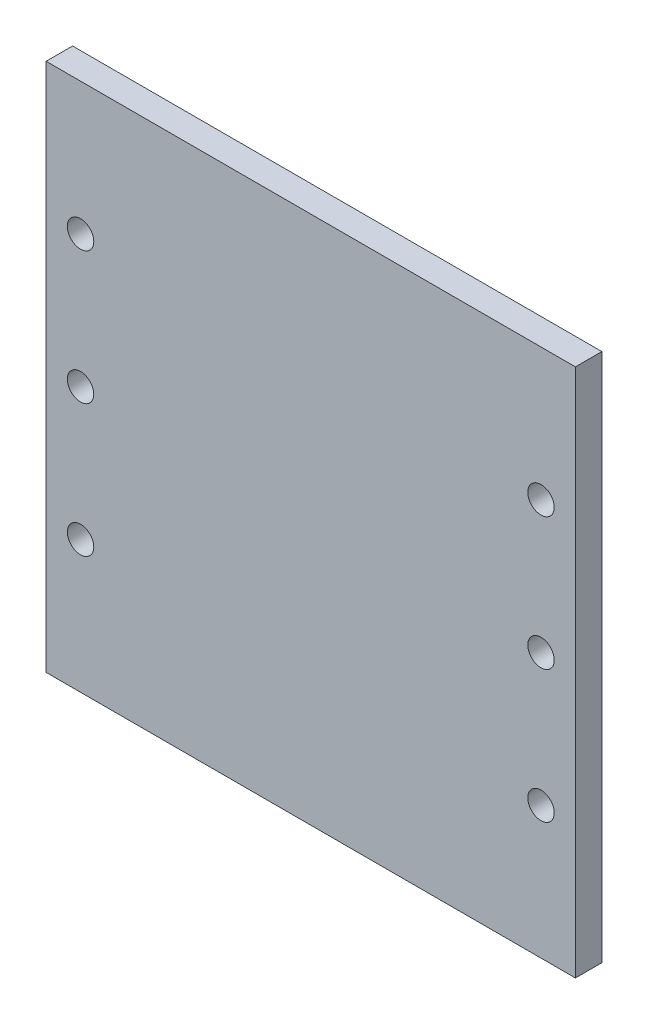
ISO-10303-21;
HEADER;
FILE_DESCRIPTION(('STEP AP214'),'2;1');
FILE_NAME('part.step','',(''),(''),'','','');
FILE_SCHEMA(('AUTOMOTIVE_DESIGN { 1 0 10303 214 1 1 1 1 }'));
ENDSEC;
DATA;
#1=APPLICATION_CONTEXT('core data for automotive mechanical design processes');
#2=APPLICATION_PROTOCOL_DEFINITION('international standard','automotive_design',2000,#1);
#3=PRODUCT_CONTEXT('',#1,'mechanical');
#4=PRODUCT('Part','Part','',(#3));
#5=PRODUCT_RELATED_PRODUCT_CATEGORY('part','',(#4));
#6=PRODUCT_DEFINITION_FORMATION('','',#4);
#7=PRODUCT_DEFINITION_CONTEXT('part definition',#1,'design');
#8=PRODUCT_DEFINITION('design','',#6,#7);
#9=PRODUCT_DEFINITION_SHAPE('','',#8);
#10=(LENGTH_UNIT() NAMED_UNIT(*) SI_UNIT(.MILLI.,.METRE.));
#11=(NAMED_UNIT(*) PLANE_ANGLE_UNIT() SI_UNIT($,.RADIAN.));
#12=(NAMED_UNIT(*) SI_UNIT($,.STERADIAN.) SOLID_ANGLE_UNIT());
#13=UNCERTAINTY_MEASURE_WITH_UNIT(LENGTH_MEASURE(1.E-05),#10,'distance_accuracy_value','');
#14=(GEOMETRIC_REPRESENTATION_CONTEXT(3) GLOBAL_UNCERTAINTY_ASSIGNED_CONTEXT((#13)) GLOBAL_UNIT_ASSIGNED_CONTEXT((#10,
#11,#12)) REPRESENTATION_CONTEXT('',''));
#15=CARTESIAN_POINT('',(0.,0.,0.));
#16=DIRECTION('',(0.,0.,1.));
#17=DIRECTION('',(1.,0.,0.));
#18=AXIS2_PLACEMENT_3D('',#15,#16,#17);
#19=CARTESIAN_POINT('',(0.,0.,5.));
#20=DIRECTION('',(0.,0.,-1.));
#21=DIRECTION('',(-1.,0.,0.));
#22=AXIS2_PLACEMENT_3D('',#19,#20,#21);
#23=PLANE('',#22);
#24=DIRECTION('',(0.,-1.,0.));
#25=VECTOR('',#24,1.);
#26=CARTESIAN_POINT('',(0.,0.,5.));
#27=LINE('',#26,#25);
#28=CARTESIAN_POINT('',(0.,100.,5.));
#29=VERTEX_POINT('',#28);
#30=CARTESIAN_POINT('',(0.,0.,5.));
#31=VERTEX_POINT('',#30);
#32=EDGE_CURVE('E84',#29,#31,#27,.T.);
#33=ORIENTED_EDGE('',*,*,#32,.T.);
#34=DIRECTION('',(1.,0.,0.));
#35=VECTOR('',#34,1.);
#36=CARTESIAN_POINT('',(0.,0.,5.));
#37=LINE('',#36,#35);
#38=CARTESIAN_POINT('',(100.,0.,5.));
#39=VERTEX_POINT('',#38);
#40=EDGE_CURVE('E79',#31,#39,#37,.T.);
#41=ORIENTED_EDGE('',*,*,#40,.T.);
#42=DIRECTION('',(0.,1.,0.));
#43=VECTOR('',#42,1.);
#44=CARTESIAN_POINT('',(100.,0.,5.));
#45=LINE('',#44,#43);
#46=CARTESIAN_POINT('',(100.,100.,5.));
#47=VERTEX_POINT('',#46);
#48=EDGE_CURVE('E82',#39,#47,#45,.T.);
#49=ORIENTED_EDGE('',*,*,#48,.T.);
#50=DIRECTION('',(-1.,0.,0.));
#51=VECTOR('',#50,1.);
#52=CARTESIAN_POINT('',(0.,100.,5.));
#53=LINE('',#52,#51);
#54=EDGE_CURVE('E49',#47,#29,#53,.T.);
#55=ORIENTED_EDGE('',*,*,#54,.T.);
#56=EDGE_LOOP('',(#33,#41,#49,#55));
#57=FACE_BOUND('',#56,.T.);
#58=CARTESIAN_POINT('',(6.5,75.,5.));
#59=DIRECTION('',(0.,0.,1.));
#60=DIRECTION('',(1.,0.,0.));
#61=AXIS2_PLACEMENT_3D('',#58,#59,#60);
#62=CIRCLE('',#61,2.5);
#63=CARTESIAN_POINT('',(9.,75.,5.));
#64=VERTEX_POINT('',#63);
#65=EDGE_CURVE('E99',#64,#64,#62,.T.);
#66=ORIENTED_EDGE('',*,*,#65,.F.);
#67=EDGE_LOOP('',(#66));
#68=FACE_BOUND('',#67,.T.);
#69=CARTESIAN_POINT('',(6.5,50.,5.));
#70=DIRECTION('',(0.,0.,1.));
#71=DIRECTION('',(1.,0.,0.));
#72=AXIS2_PLACEMENT_3D('',#69,#70,#71);
#73=CIRCLE('',#72,2.5);
#74=CARTESIAN_POINT('',(9.,50.,5.));
#75=VERTEX_POINT('',#74);
#76=EDGE_CURVE('E114',#75,#75,#73,.T.);
#77=ORIENTED_EDGE('',*,*,#76,.F.);
#78=EDGE_LOOP('',(#77));
#79=FACE_BOUND('',#78,.T.);
#80=CARTESIAN_POINT('',(6.5,25.,5.));
#81=DIRECTION('',(0.,0.,1.));
#82=DIRECTION('',(1.,0.,0.));
#83=AXIS2_PLACEMENT_3D('',#80,#81,#82);
#84=CIRCLE('',#83,2.5);
#85=CARTESIAN_POINT('',(9.,25.,5.));
#86=VERTEX_POINT('',#85);
#87=EDGE_CURVE('E120',#86,#86,#84,.T.);
#88=ORIENTED_EDGE('',*,*,#87,.F.);
#89=EDGE_LOOP('',(#88));
#90=FACE_BOUND('',#89,.T.);
#91=CARTESIAN_POINT('',(93.5,25.,5.));
#92=DIRECTION('',(0.,0.,1.));
#93=DIRECTION('',(1.,0.,0.));
#94=AXIS2_PLACEMENT_3D('',#91,#92,#93);
#95=CIRCLE('',#94,2.5);
#96=CARTESIAN_POINT('',(96.,25.,5.));
#97=VERTEX_POINT('',#96);
#98=EDGE_CURVE('E126',#97,#97,#95,.T.);
#99=ORIENTED_EDGE('',*,*,#98,.F.);
#100=EDGE_LOOP('',(#99));
#101=FACE_BOUND('',#100,.T.);
#102=CARTESIAN_POINT('',(93.5,50.,5.));
#103=DIRECTION('',(0.,0.,1.));
#104=DIRECTION('',(1.,0.,0.));
#105=AXIS2_PLACEMENT_3D('',#102,#103,#104);
#106=CIRCLE('',#105,2.50000000000001);
#107=CARTESIAN_POINT('',(96.,50.,5.));
#108=VERTEX_POINT('',#107);
#109=EDGE_CURVE('E132',#108,#108,#106,.T.);
#110=ORIENTED_EDGE('',*,*,#109,.F.);
#111=EDGE_LOOP('',(#110));
#112=FACE_BOUND('',#111,.T.);
#113=CARTESIAN_POINT('',(93.5,75.,5.));
#114=DIRECTION('',(0.,0.,1.));
#115=DIRECTION('',(1.,0.,0.));
#116=AXIS2_PLACEMENT_3D('',#113,#114,#115);
#117=CIRCLE('',#116,2.50000000000001);
#118=CARTESIAN_POINT('',(96.,75.,5.));
#119=VERTEX_POINT('',#118);
#120=EDGE_CURVE('E138',#119,#119,#117,.T.);
#121=ORIENTED_EDGE('',*,*,#120,.F.);
#122=EDGE_LOOP('',(#121));
#123=FACE_BOUND('',#122,.T.);
#124=ADVANCED_FACE('F32',(#57,#68,#79,#90,#101,#112,#123),#23,.F.);
#125=CARTESIAN_POINT('',(0.,0.,0.));
#126=DIRECTION('',(0.,0.,-1.));
#127=DIRECTION('',(-1.,0.,0.));
#128=AXIS2_PLACEMENT_3D('',#125,#126,#127);
#129=PLANE('',#128);
#130=CARTESIAN_POINT('',(93.5,50.,0.));
#131=DIRECTION('',(0.,0.,1.));
#132=DIRECTION('',(1.,0.,0.));
#133=AXIS2_PLACEMENT_3D('',#130,#131,#132);
#134=CIRCLE('',#133,2.50000000000001);
#135=CARTESIAN_POINT('',(96.,50.,0.));
#136=VERTEX_POINT('',#135);
#137=EDGE_CURVE('E135',#136,#136,#134,.T.);
#138=ORIENTED_EDGE('',*,*,#137,.T.);
#139=EDGE_LOOP('',(#138));
#140=FACE_BOUND('',#139,.T.);
#141=CARTESIAN_POINT('',(6.5,25.,0.));
#142=DIRECTION('',(0.,0.,1.));
#143=DIRECTION('',(1.,0.,0.));
#144=AXIS2_PLACEMENT_3D('',#141,#142,#143);
#145=CIRCLE('',#144,2.5);
#146=CARTESIAN_POINT('',(9.,25.,0.));
#147=VERTEX_POINT('',#146);
#148=EDGE_CURVE('E123',#147,#147,#145,.T.);
#149=ORIENTED_EDGE('',*,*,#148,.T.);
#150=EDGE_LOOP('',(#149));
#151=FACE_BOUND('',#150,.T.);
#152=CARTESIAN_POINT('',(6.5,75.,0.));
#153=DIRECTION('',(0.,0.,1.));
#154=DIRECTION('',(1.,0.,0.));
#155=AXIS2_PLACEMENT_3D('',#152,#153,#154);
#156=CIRCLE('',#155,2.5);
#157=CARTESIAN_POINT('',(9.,75.,0.));
#158=VERTEX_POINT('',#157);
#159=EDGE_CURVE('E111',#158,#158,#156,.T.);
#160=ORIENTED_EDGE('',*,*,#159,.T.);
#161=EDGE_LOOP('',(#160));
#162=FACE_BOUND('',#161,.T.);
#163=DIRECTION('',(0.,-1.,0.));
#164=VECTOR('',#163,1.);
#165=CARTESIAN_POINT('',(0.,0.,0.));
#166=LINE('',#165,#164);
#167=CARTESIAN_POINT('',(0.,100.,0.));
#168=VERTEX_POINT('',#167);
#169=CARTESIAN_POINT('',(0.,0.,0.));
#170=VERTEX_POINT('',#169);
#171=EDGE_CURVE('E96',#168,#170,#166,.T.);
#172=ORIENTED_EDGE('',*,*,#171,.F.);
#173=DIRECTION('',(-1.,0.,0.));
#174=VECTOR('',#173,1.);
#175=CARTESIAN_POINT('',(0.,100.,0.));
#176=LINE('',#175,#174);
#177=CARTESIAN_POINT('',(100.,100.,0.));
#178=VERTEX_POINT('',#177);
#179=EDGE_CURVE('E72',#178,#168,#176,.T.);
#180=ORIENTED_EDGE('',*,*,#179,.F.);
#181=DIRECTION('',(0.,1.,0.));
#182=VECTOR('',#181,1.);
#183=CARTESIAN_POINT('',(100.,0.,0.));
#184=LINE('',#183,#182);
#185=CARTESIAN_POINT('',(100.,0.,0.));
#186=VERTEX_POINT('',#185);
#187=EDGE_CURVE('E66',#186,#178,#184,.T.);
#188=ORIENTED_EDGE('',*,*,#187,.F.);
#189=DIRECTION('',(1.,0.,0.));
#190=VECTOR('',#189,1.);
#191=CARTESIAN_POINT('',(0.,0.,0.));
#192=LINE('',#191,#190);
#193=EDGE_CURVE('E88',#170,#186,#192,.T.);
#194=ORIENTED_EDGE('',*,*,#193,.F.);
#195=EDGE_LOOP('',(#172,#180,#188,#194));
#196=FACE_BOUND('',#195,.T.);
#197=CARTESIAN_POINT('',(6.5,50.,0.));
#198=DIRECTION('',(0.,0.,1.));
#199=DIRECTION('',(1.,0.,0.));
#200=AXIS2_PLACEMENT_3D('',#197,#198,#199);
#201=CIRCLE('',#200,2.5);
#202=CARTESIAN_POINT('',(9.,50.,0.));
#203=VERTEX_POINT('',#202);
#204=EDGE_CURVE('E117',#203,#203,#201,.T.);
#205=ORIENTED_EDGE('',*,*,#204,.T.);
#206=EDGE_LOOP('',(#205));
#207=FACE_BOUND('',#206,.T.);
#208=CARTESIAN_POINT('',(93.5,25.,0.));
#209=DIRECTION('',(0.,0.,1.));
#210=DIRECTION('',(1.,0.,0.));
#211=AXIS2_PLACEMENT_3D('',#208,#209,#210);
#212=CIRCLE('',#211,2.5);
#213=CARTESIAN_POINT('',(96.,25.,0.));
#214=VERTEX_POINT('',#213);
#215=EDGE_CURVE('E129',#214,#214,#212,.T.);
#216=ORIENTED_EDGE('',*,*,#215,.T.);
#217=EDGE_LOOP('',(#216));
#218=FACE_BOUND('',#217,.T.);
#219=CARTESIAN_POINT('',(93.5,75.,0.));
#220=DIRECTION('',(0.,0.,1.));
#221=DIRECTION('',(1.,0.,0.));
#222=AXIS2_PLACEMENT_3D('',#219,#220,#221);
#223=CIRCLE('',#222,2.50000000000001);
#224=CARTESIAN_POINT('',(96.,75.,0.));
#225=VERTEX_POINT('',#224);
#226=EDGE_CURVE('E141',#225,#225,#223,.T.);
#227=ORIENTED_EDGE('',*,*,#226,.T.);
#228=EDGE_LOOP('',(#227));
#229=FACE_BOUND('',#228,.T.);
#230=ADVANCED_FACE('F107',(#140,#151,#162,#196,#207,#218,#229),#129,.T.);
#231=CARTESIAN_POINT('',(0.,0.,5.));
#232=DIRECTION('',(1.,0.,0.));
#233=DIRECTION('',(0.,1.,0.));
#234=AXIS2_PLACEMENT_3D('',#231,#232,#233);
#235=PLANE('',#234);
#236=ORIENTED_EDGE('',*,*,#171,.T.);
#237=DIRECTION('',(0.,0.,-1.));
#238=VECTOR('',#237,1.);
#239=CARTESIAN_POINT('',(0.,0.,5.));
#240=LINE('',#239,#238);
#241=EDGE_CURVE('E11',#31,#170,#240,.T.);
#242=ORIENTED_EDGE('',*,*,#241,.F.);
#243=ORIENTED_EDGE('',*,*,#32,.F.);
#244=DIRECTION('',(0.,0.,-1.));
#245=VECTOR('',#244,1.);
#246=CARTESIAN_POINT('',(0.,100.,5.));
#247=LINE('',#246,#245);
#248=EDGE_CURVE('E92',#29,#168,#247,.T.);
#249=ORIENTED_EDGE('',*,*,#248,.T.);
#250=EDGE_LOOP('',(#236,#242,#243,#249));
#251=FACE_BOUND('',#250,.T.);
#252=ADVANCED_FACE('F34',(#251),#235,.F.);
#253=CARTESIAN_POINT('',(0.,0.,5.));
#254=DIRECTION('',(0.,1.,0.));
#255=DIRECTION('',(0.,0.,1.));
#256=AXIS2_PLACEMENT_3D('',#253,#254,#255);
#257=PLANE('',#256);
#258=ORIENTED_EDGE('',*,*,#193,.T.);
#259=DIRECTION('',(0.,0.,-1.));
#260=VECTOR('',#259,1.);
#261=CARTESIAN_POINT('',(100.,0.,5.));
#262=LINE('',#261,#260);
#263=EDGE_CURVE('E41',#39,#186,#262,.T.);
#264=ORIENTED_EDGE('',*,*,#263,.F.);
#265=ORIENTED_EDGE('',*,*,#40,.F.);
#266=ORIENTED_EDGE('',*,*,#241,.T.);
#267=EDGE_LOOP('',(#258,#264,#265,#266));
#268=FACE_BOUND('',#267,.T.);
#269=ADVANCED_FACE('F87',(#268),#257,.F.);
#270=CARTESIAN_POINT('',(100.,0.,5.));
#271=DIRECTION('',(-1.,0.,0.));
#272=DIRECTION('',(0.,-1.,0.));
#273=AXIS2_PLACEMENT_3D('',#270,#271,#272);
#274=PLANE('',#273);
#275=ORIENTED_EDGE('',*,*,#187,.T.);
#276=DIRECTION('',(0.,0.,-1.));
#277=VECTOR('',#276,1.);
#278=CARTESIAN_POINT('',(100.,100.,5.));
#279=LINE('',#278,#277);
#280=EDGE_CURVE('E89',#47,#178,#279,.T.);
#281=ORIENTED_EDGE('',*,*,#280,.F.);
#282=ORIENTED_EDGE('',*,*,#48,.F.);
#283=ORIENTED_EDGE('',*,*,#263,.T.);
#284=EDGE_LOOP('',(#275,#281,#282,#283));
#285=FACE_BOUND('',#284,.T.);
#286=ADVANCED_FACE('F90',(#285),#274,.F.);
#287=CARTESIAN_POINT('',(0.,100.,5.));
#288=DIRECTION('',(0.,-1.,0.));
#289=DIRECTION('',(0.,0.,-1.));
#290=AXIS2_PLACEMENT_3D('',#287,#288,#289);
#291=PLANE('',#290);
#292=ORIENTED_EDGE('',*,*,#179,.T.);
#293=ORIENTED_EDGE('',*,*,#248,.F.);
#294=ORIENTED_EDGE('',*,*,#54,.F.);
#295=ORIENTED_EDGE('',*,*,#280,.T.);
#296=EDGE_LOOP('',(#292,#293,#294,#295));
#297=FACE_BOUND('',#296,.T.);
#298=ADVANCED_FACE('F104',(#297),#291,.F.);
#299=CARTESIAN_POINT('',(6.5,75.,5.));
#300=DIRECTION('',(0.,0.,-1.));
#301=DIRECTION('',(-1.,0.,0.));
#302=AXIS2_PLACEMENT_3D('',#299,#300,#301);
#303=CYLINDRICAL_SURFACE('',#302,2.5);
#304=ORIENTED_EDGE('',*,*,#65,.T.);
#305=EDGE_LOOP('',(#304));
#306=FACE_BOUND('',#305,.T.);
#307=ORIENTED_EDGE('',*,*,#159,.F.);
#308=EDGE_LOOP('',(#307));
#309=FACE_BOUND('',#308,.T.);
#310=ADVANCED_FACE('F158',(#306,#309),#303,.F.);
#311=CARTESIAN_POINT('',(6.5,50.,5.));
#312=DIRECTION('',(0.,0.,-1.));
#313=DIRECTION('',(-1.,0.,0.));
#314=AXIS2_PLACEMENT_3D('',#311,#312,#313);
#315=CYLINDRICAL_SURFACE('',#314,2.5);
#316=ORIENTED_EDGE('',*,*,#76,.T.);
#317=EDGE_LOOP('',(#316));
#318=FACE_BOUND('',#317,.T.);
#319=ORIENTED_EDGE('',*,*,#204,.F.);
#320=EDGE_LOOP('',(#319));
#321=FACE_BOUND('',#320,.T.);
#322=ADVANCED_FACE('F204',(#318,#321),#315,.F.);
#323=CARTESIAN_POINT('',(6.5,25.,5.));
#324=DIRECTION('',(0.,0.,-1.));
#325=DIRECTION('',(-1.,0.,0.));
#326=AXIS2_PLACEMENT_3D('',#323,#324,#325);
#327=CYLINDRICAL_SURFACE('',#326,2.5);
#328=ORIENTED_EDGE('',*,*,#87,.T.);
#329=EDGE_LOOP('',(#328));
#330=FACE_BOUND('',#329,.T.);
#331=ORIENTED_EDGE('',*,*,#148,.F.);
#332=EDGE_LOOP('',(#331));
#333=FACE_BOUND('',#332,.T.);
#334=ADVANCED_FACE('F212',(#330,#333),#327,.F.);
#335=CARTESIAN_POINT('',(93.5,25.,5.));
#336=DIRECTION('',(0.,0.,-1.));
#337=DIRECTION('',(-1.,0.,0.));
#338=AXIS2_PLACEMENT_3D('',#335,#336,#337);
#339=CYLINDRICAL_SURFACE('',#338,2.5);
#340=ORIENTED_EDGE('',*,*,#98,.T.);
#341=EDGE_LOOP('',(#340));
#342=FACE_BOUND('',#341,.T.);
#343=ORIENTED_EDGE('',*,*,#215,.F.);
#344=EDGE_LOOP('',(#343));
#345=FACE_BOUND('',#344,.T.);
#346=ADVANCED_FACE('F220',(#342,#345),#339,.F.);
#347=CARTESIAN_POINT('',(93.5,50.,5.));
#348=DIRECTION('',(0.,0.,-1.));
#349=DIRECTION('',(-1.,0.,0.));
#350=AXIS2_PLACEMENT_3D('',#347,#348,#349);
#351=CYLINDRICAL_SURFACE('',#350,2.50000000000001);
#352=ORIENTED_EDGE('',*,*,#109,.T.);
#353=EDGE_LOOP('',(#352));
#354=FACE_BOUND('',#353,.T.);
#355=ORIENTED_EDGE('',*,*,#137,.F.);
#356=EDGE_LOOP('',(#355));
#357=FACE_BOUND('',#356,.T.);
#358=ADVANCED_FACE('F229',(#354,#357),#351,.F.);
#359=CARTESIAN_POINT('',(93.5,75.,5.));
#360=DIRECTION('',(0.,0.,-1.));
#361=DIRECTION('',(-1.,0.,0.));
#362=AXIS2_PLACEMENT_3D('',#359,#360,#361);
#363=CYLINDRICAL_SURFACE('',#362,2.50000000000001);
#364=ORIENTED_EDGE('',*,*,#120,.T.);
#365=EDGE_LOOP('',(#364));
#366=FACE_BOUND('',#365,.T.);
#367=ORIENTED_EDGE('',*,*,#226,.F.);
#368=EDGE_LOOP('',(#367));
#369=FACE_BOUND('',#368,.T.);
#370=ADVANCED_FACE('F147',(#366,#369),#363,.F.);
#371=CLOSED_SHELL('',(#124,#230,#252,#269,#286,#298,#310,#322,#334,#346,#358,#370));
#372=MANIFOLD_SOLID_BREP('B2',#371);
#373=ADVANCED_BREP_SHAPE_REPRESENTATION('',(#18,#372),#14);
#374=SHAPE_DEFINITION_REPRESENTATION(#9,#373);
ENDSEC;
END-ISO-10303-21;
